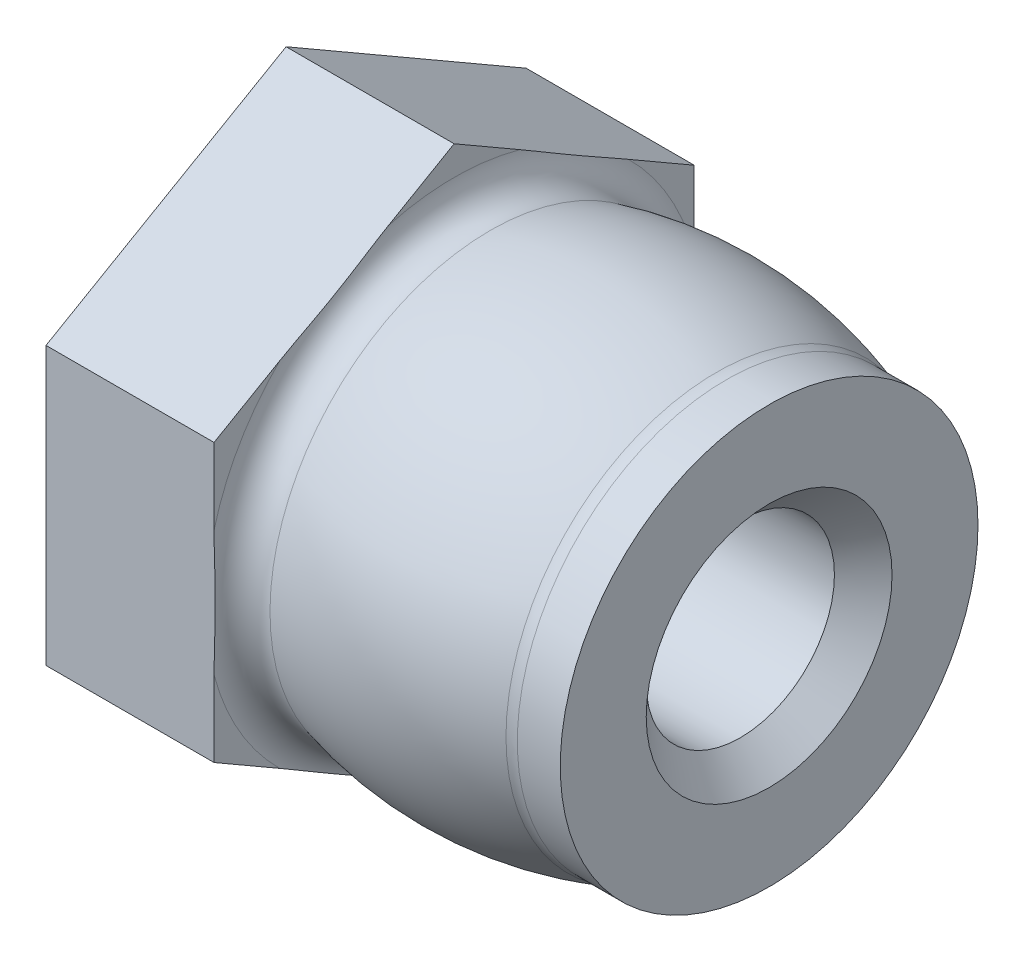
ISO-10303-21;
HEADER;
FILE_DESCRIPTION(('STEP AP214'),'2;1');
FILE_NAME('part.step','',(''),(''),'','','');
FILE_SCHEMA(('AUTOMOTIVE_DESIGN { 1 0 10303 214 1 1 1 1 }'));
ENDSEC;
DATA;
#1=APPLICATION_CONTEXT('core data for automotive mechanical design processes');
#2=APPLICATION_PROTOCOL_DEFINITION('international standard','automotive_design',2000,#1);
#3=PRODUCT_CONTEXT('',#1,'mechanical');
#4=PRODUCT('Part','Part','',(#3));
#5=PRODUCT_RELATED_PRODUCT_CATEGORY('part','',(#4));
#6=PRODUCT_DEFINITION_FORMATION('','',#4);
#7=PRODUCT_DEFINITION_CONTEXT('part definition',#1,'design');
#8=PRODUCT_DEFINITION('design','',#6,#7);
#9=PRODUCT_DEFINITION_SHAPE('','',#8);
#10=(LENGTH_UNIT() NAMED_UNIT(*) SI_UNIT(.MILLI.,.METRE.));
#11=(NAMED_UNIT(*) PLANE_ANGLE_UNIT() SI_UNIT($,.RADIAN.));
#12=(NAMED_UNIT(*) SI_UNIT($,.STERADIAN.) SOLID_ANGLE_UNIT());
#13=UNCERTAINTY_MEASURE_WITH_UNIT(LENGTH_MEASURE(1.E-05),#10,'distance_accuracy_value','');
#14=(GEOMETRIC_REPRESENTATION_CONTEXT(3) GLOBAL_UNCERTAINTY_ASSIGNED_CONTEXT((#13)) GLOBAL_UNIT_ASSIGNED_CONTEXT((#10,
#11,#12)) REPRESENTATION_CONTEXT('',''));
#15=CARTESIAN_POINT('',(0.,0.,0.));
#16=DIRECTION('',(0.,0.,1.));
#17=DIRECTION('',(1.,0.,0.));
#18=AXIS2_PLACEMENT_3D('',#15,#16,#17);
#19=CARTESIAN_POINT('',(-3.1496,0.,0.));
#20=DIRECTION('',(-1.,0.,0.));
#21=DIRECTION('',(0.,0.,1.));
#22=AXIS2_PLACEMENT_3D('',#19,#20,#21);
#23=TOROIDAL_SURFACE('',#22,3.28147087392028,0.381);
#24=CARTESIAN_POINT('',(-3.05302093023256,0.,0.));
#25=DIRECTION('',(1.,0.,0.));
#26=DIRECTION('',(0.,0.,-1.));
#27=AXIS2_PLACEMENT_3D('',#24,#25,#26);
#28=CIRCLE('',#27,2.91291493070018);
#29=CARTESIAN_POINT('',(-3.05302093023256,0.,-2.91291493070018));
#30=VERTEX_POINT('',#29);
#31=EDGE_CURVE('E208',#30,#30,#28,.T.);
#32=ORIENTED_EDGE('',*,*,#31,.F.);
#33=EDGE_LOOP('',(#32));
#34=FACE_BOUND('',#33,.T.);
#35=CARTESIAN_POINT('',(-3.5306,-2.33507484159772,-2.3055317348769));
#36=CARTESIAN_POINT('',(-3.53055765508547,-2.36684029242587,-2.25051236011721));
#37=CARTESIAN_POINT('',(-3.52958549215016,-2.39859672747296,-2.1955086011484));
#38=CARTESIAN_POINT('',(-3.52677003490047,-2.46210644959249,-2.08550653566278));
#39=CARTESIAN_POINT('',(-3.52492659318719,-2.49385973522266,-2.03050823164409));
#40=CARTESIAN_POINT('',(-3.52135849088085,-2.55735441103041,-1.92053222713495));
#41=CARTESIAN_POINT('',(-3.51963378238957,-2.58909580080618,-1.86555452734046));
#42=CARTESIAN_POINT('',(-3.51696013030434,-2.65258238657601,-1.75559253518804));
#43=CARTESIAN_POINT('',(-3.51601104894515,-2.68432758089205,-1.70060824573651));
#44=CARTESIAN_POINT('',(-3.51514199200617,-2.75609259313813,-1.5763075983205));
#45=CARTESIAN_POINT('',(-3.51555451918949,-2.79611362793693,-1.50698913267749));
#46=CARTESIAN_POINT('',(-3.5179633927956,-2.8761502624632,-1.36836161521118));
#47=CARTESIAN_POINT('',(-3.5199600992427,-2.91616585888692,-1.29905256911013));
#48=CARTESIAN_POINT('',(-3.52437818788094,-2.99621263915529,-1.16040747870301));
#49=CARTESIAN_POINT('',(-3.52679980587722,-3.03624381927555,-1.09107144084778));
#50=CARTESIAN_POINT('',(-3.5293489035481,-3.09629907157537,-0.987052692603111));
#51=CARTESIAN_POINT('',(-3.5300180297608,-3.11631606273206,-0.952382246905067));
#52=CARTESIAN_POINT('',(-3.53069426141412,-3.15635563444809,-0.883031674379615));
#53=CARTESIAN_POINT('',(-3.53070126070804,-3.17637821538903,-0.848351546891233));
#54=CARTESIAN_POINT('',(-3.53022641879167,-3.19640081785184,-0.813671382125909));
#55=B_SPLINE_CURVE_WITH_KNOTS('',3,(#35,#36,#37,#38,#39,#40,#41,#42,#43,#44,#45,#46,#47,#48,#49,
#50,#51,#52,#53,#54),.UNSPECIFIED.,.F.,.F.,(4,2,2,2,2,2,2,2,2,4),(0.,0.190563513789127,
0.381159277771389,0.571677697342065,0.762162270079211,1.00227005055033,1.24243241411767,
1.48272848003566,1.6028424420732,1.72297565975444),.UNSPECIFIED.);
#56=CARTESIAN_POINT('',(-3.5306,-2.33507484159772,-2.3055317348769));
#57=VERTEX_POINT('',#56);
#58=CARTESIAN_POINT('',(-3.5306,-3.16418647243347,-0.869468265123098));
#59=VERTEX_POINT('',#58);
#60=EDGE_CURVE('E290',#57,#59,#55,.T.);
#61=ORIENTED_EDGE('',*,*,#60,.F.);
#62=CARTESIAN_POINT('',(-3.5306,0.,0.));
#63=DIRECTION('',(-1.,0.,0.));
#64=DIRECTION('',(0.,0.,1.));
#65=AXIS2_PLACEMENT_3D('',#62,#63,#64);
#66=CIRCLE('',#65,3.28147087392028);
#67=CARTESIAN_POINT('',(-3.5306,-0.829111630835748,-3.175));
#68=VERTEX_POINT('',#67);
#69=EDGE_CURVE('E193',#68,#57,#66,.T.);
#70=ORIENTED_EDGE('',*,*,#69,.F.);
#71=CARTESIAN_POINT('',(-3.5306,0.829111630835748,-3.175));
#72=CARTESIAN_POINT('',(-3.53055765508547,0.765580729179442,-3.175));
#73=CARTESIAN_POINT('',(-3.52958549215016,0.702067859085271,-3.175));
#74=CARTESIAN_POINT('',(-3.52677003490047,0.575048414846204,-3.175));
#75=CARTESIAN_POINT('',(-3.52492659318719,0.511541843585867,-3.175));
#76=CARTESIAN_POINT('',(-3.52135849088085,0.384552491970374,-3.175));
#77=CARTESIAN_POINT('',(-3.51963378238957,0.32106971241882,-3.175));
#78=CARTESIAN_POINT('',(-3.51696013030434,0.19409654087916,-3.175));
#79=CARTESIAN_POINT('',(-3.51601104894515,0.130606152247084,-3.175));
#80=CARTESIAN_POINT('',(-3.51514199200617,-0.0129238722450689,-3.175));
#81=CARTESIAN_POINT('',(-3.51555451918949,-0.0929659418426836,-3.175));
#82=CARTESIAN_POINT('',(-3.5179633927956,-0.253039210895213,-3.175));
#83=CARTESIAN_POINT('',(-3.5199600992427,-0.333070403742649,-3.175));
#84=CARTESIAN_POINT('',(-3.52437818788094,-0.493163964279386,-3.175));
#85=CARTESIAN_POINT('',(-3.52679980587722,-0.573226324519909,-3.175));
#86=CARTESIAN_POINT('',(-3.5293489035481,-0.69333682911956,-3.175));
#87=CARTESIAN_POINT('',(-3.5300180297608,-0.733370811432939,-3.175));
#88=CARTESIAN_POINT('',(-3.53069426141412,-0.813449954864989,-3.175));
#89=CARTESIAN_POINT('',(-3.53070126070804,-0.853495116746885,-3.175));
#90=CARTESIAN_POINT('',(-3.53022641879167,-0.893540321672486,-3.175));
#91=B_SPLINE_CURVE_WITH_KNOTS('',3,(#71,#72,#73,#74,#75,#76,#77,#78,#79,#80,#81,#82,#83,#84,#85,
#86,#87,#88,#89,#90),.UNSPECIFIED.,.F.,.F.,(4,2,2,2,2,2,2,2,2,4),(0.,0.190563513789126,
0.381159277771389,0.571677697342065,0.76216227007921,1.00227005055033,1.24243241411767,
1.48272848003566,1.6028424420732,1.72297565975444),.UNSPECIFIED.);
#92=CARTESIAN_POINT('',(-3.5306,0.829111630835748,-3.175));
#93=VERTEX_POINT('',#92);
#94=EDGE_CURVE('E63',#93,#68,#91,.T.);
#95=ORIENTED_EDGE('',*,*,#94,.F.);
#96=CARTESIAN_POINT('',(-3.5306,0.,0.));
#97=DIRECTION('',(-1.,0.,0.));
#98=DIRECTION('',(0.,0.,1.));
#99=AXIS2_PLACEMENT_3D('',#96,#97,#98);
#100=CIRCLE('',#99,3.28147087392028);
#101=CARTESIAN_POINT('',(-3.5306,2.33507484159772,-2.3055317348769));
#102=VERTEX_POINT('',#101);
#103=EDGE_CURVE('E196',#102,#93,#100,.T.);
#104=ORIENTED_EDGE('',*,*,#103,.F.);
#105=CARTESIAN_POINT('',(-3.5306,3.16418647243347,-0.869468265123102));
#106=CARTESIAN_POINT('',(-3.53055765508547,3.13242102160531,-0.924487639882794));
#107=CARTESIAN_POINT('',(-3.52958549215016,3.10066458655823,-0.979491398851606));
#108=CARTESIAN_POINT('',(-3.52677003490047,3.03715486443869,-1.08949346433722));
#109=CARTESIAN_POINT('',(-3.52492659318719,3.00540157880852,-1.14449176835592));
#110=CARTESIAN_POINT('',(-3.52135849088085,2.94190690300078,-1.25446777286505));
#111=CARTESIAN_POINT('',(-3.51963378238957,2.910165513225,-1.30944547265954));
#112=CARTESIAN_POINT('',(-3.51696013030434,2.84667892745517,-1.41940746481197));
#113=CARTESIAN_POINT('',(-3.51601104894515,2.81493373313913,-1.47439175426349));
#114=CARTESIAN_POINT('',(-3.51514199200617,2.74316872089306,-1.5986924016795));
#115=CARTESIAN_POINT('',(-3.51555451918949,2.70314768609425,-1.66801086732251));
#116=CARTESIAN_POINT('',(-3.5179633927956,2.62311105156799,-1.80663838478882));
#117=CARTESIAN_POINT('',(-3.5199600992427,2.58309545514427,-1.87594743088987));
#118=CARTESIAN_POINT('',(-3.52437818788094,2.50304867487591,-2.01459252129698));
#119=CARTESIAN_POINT('',(-3.52679980587722,2.46301749475565,-2.08392855915221));
#120=CARTESIAN_POINT('',(-3.5293489035481,2.40296224245582,-2.18794730739688));
#121=CARTESIAN_POINT('',(-3.5300180297608,2.38294525129913,-2.22261775309492));
#122=CARTESIAN_POINT('',(-3.53069426141412,2.34290567958311,-2.29196832562037));
#123=CARTESIAN_POINT('',(-3.53070126070804,2.32288309864216,-2.32664845310875));
#124=CARTESIAN_POINT('',(-3.53022641879167,2.30286049617936,-2.36132861787408));
#125=B_SPLINE_CURVE_WITH_KNOTS('',3,(#105,#106,#107,#108,#109,#110,#111,#112,#113,#114,#115,
#116,#117,#118,#119,#120,#121,#122,#123,#124),.UNSPECIFIED.,.F.,.F.,(4,2,2,2,2,2,2,2,2,4),(0.,
0.190563513789126,0.381159277771389,0.571677697342065,0.76216227007921,1.00227005055032,
1.24243241411765,1.48272848003564,1.60284244207318,1.72297565975442),.UNSPECIFIED.);
#126=CARTESIAN_POINT('',(-3.5306,3.16418647243347,-0.869468265123102));
#127=VERTEX_POINT('',#126);
#128=EDGE_CURVE('E251',#127,#102,#125,.T.);
#129=ORIENTED_EDGE('',*,*,#128,.F.);
#130=CARTESIAN_POINT('',(-3.5306,0.,0.));
#131=DIRECTION('',(-1.,0.,0.));
#132=DIRECTION('',(0.,0.,1.));
#133=AXIS2_PLACEMENT_3D('',#130,#131,#132);
#134=CIRCLE('',#133,3.28147087392028);
#135=CARTESIAN_POINT('',(-3.5306,3.16418647243347,0.869468265123102));
#136=VERTEX_POINT('',#135);
#137=EDGE_CURVE('E143',#136,#127,#134,.T.);
#138=ORIENTED_EDGE('',*,*,#137,.F.);
#139=CARTESIAN_POINT('',(-3.5306,2.33507484159772,2.3055317348769));
#140=CARTESIAN_POINT('',(-3.53055765508547,2.36684029242588,2.25051236011721));
#141=CARTESIAN_POINT('',(-3.52958549215016,2.39859672747296,2.19550860114839));
#142=CARTESIAN_POINT('',(-3.52677003490047,2.4621064495925,2.08550653566278));
#143=CARTESIAN_POINT('',(-3.52492659318719,2.49385973522266,2.03050823164408));
#144=CARTESIAN_POINT('',(-3.52135849088085,2.55735441103041,1.92053222713495));
#145=CARTESIAN_POINT('',(-3.51963378238957,2.58909580080619,1.86555452734046));
#146=CARTESIAN_POINT('',(-3.51696013030434,2.65258238657602,1.75559253518803));
#147=CARTESIAN_POINT('',(-3.51601104894515,2.68432758089205,1.70060824573651));
#148=CARTESIAN_POINT('',(-3.51514199200617,2.75609259313813,1.5763075983205));
#149=CARTESIAN_POINT('',(-3.51555451918949,2.79611362793694,1.50698913267749));
#150=CARTESIAN_POINT('',(-3.5179633927956,2.8761502624632,1.36836161521118));
#151=CARTESIAN_POINT('',(-3.5199600992427,2.91616585888692,1.29905256911013));
#152=CARTESIAN_POINT('',(-3.52437818788094,2.99621263915528,1.16040747870302));
#153=CARTESIAN_POINT('',(-3.52679980587722,3.03624381927554,1.09107144084778));
#154=CARTESIAN_POINT('',(-3.5293489035481,3.09629907157537,0.987052692603121));
#155=CARTESIAN_POINT('',(-3.5300180297608,3.11631606273206,0.952382246905078));
#156=CARTESIAN_POINT('',(-3.53069426141412,3.15635563444808,0.883031674379627));
#157=CARTESIAN_POINT('',(-3.53070126070804,3.17637821538903,0.848351546891246));
#158=CARTESIAN_POINT('',(-3.53022641879167,3.19640081785183,0.813671382125922));
#159=B_SPLINE_CURVE_WITH_KNOTS('',3,(#139,#140,#141,#142,#143,#144,#145,#146,#147,#148,#149,
#150,#151,#152,#153,#154,#155,#156,#157,#158),.UNSPECIFIED.,.F.,.F.,(4,2,2,2,2,2,2,2,2,4),(0.,
0.190563513789126,0.381159277771389,0.571677697342065,0.76216227007921,1.00227005055032,
1.24243241411765,1.48272848003564,1.60284244207318,1.72297565975442),.UNSPECIFIED.);
#160=CARTESIAN_POINT('',(-3.5306,2.33507484159772,2.3055317348769));
#161=VERTEX_POINT('',#160);
#162=EDGE_CURVE('E156',#161,#136,#159,.T.);
#163=ORIENTED_EDGE('',*,*,#162,.F.);
#164=CARTESIAN_POINT('',(-3.5306,0.,0.));
#165=DIRECTION('',(-1.,0.,0.));
#166=DIRECTION('',(0.,0.,1.));
#167=AXIS2_PLACEMENT_3D('',#164,#165,#166);
#168=CIRCLE('',#167,3.28147087392028);
#169=CARTESIAN_POINT('',(-3.5306,0.82911163083575,3.175));
#170=VERTEX_POINT('',#169);
#171=EDGE_CURVE('E199',#170,#161,#168,.T.);
#172=ORIENTED_EDGE('',*,*,#171,.F.);
#173=CARTESIAN_POINT('',(-3.5306,-0.82911163083575,3.175));
#174=CARTESIAN_POINT('',(-3.53055765508547,-0.765580729179444,3.175));
#175=CARTESIAN_POINT('',(-3.52958549215016,-0.702067859085273,3.175));
#176=CARTESIAN_POINT('',(-3.52677003490047,-0.575048414846206,3.175));
#177=CARTESIAN_POINT('',(-3.52492659318719,-0.511541843585869,3.175));
#178=CARTESIAN_POINT('',(-3.52135849088085,-0.384552491970376,3.175));
#179=CARTESIAN_POINT('',(-3.51963378238957,-0.321069712418823,3.175));
#180=CARTESIAN_POINT('',(-3.51696013030434,-0.194096540879162,3.175));
#181=CARTESIAN_POINT('',(-3.51601104894515,-0.130606152247087,3.175));
#182=CARTESIAN_POINT('',(-3.51514199200617,0.0129238722450674,3.175));
#183=CARTESIAN_POINT('',(-3.51555451918949,0.0929659418426831,3.175));
#184=CARTESIAN_POINT('',(-3.5179633927956,0.253039210895214,3.175));
#185=CARTESIAN_POINT('',(-3.5199600992427,0.333070403742651,3.175));
#186=CARTESIAN_POINT('',(-3.52437818788094,0.493163964279391,3.175));
#187=CARTESIAN_POINT('',(-3.52679980587722,0.573226324519914,3.175));
#188=CARTESIAN_POINT('',(-3.5293489035481,0.693336829119567,3.175));
#189=CARTESIAN_POINT('',(-3.5300180297608,0.733370811432947,3.175));
#190=CARTESIAN_POINT('',(-3.53069426141412,0.813449954864998,3.175));
#191=CARTESIAN_POINT('',(-3.53070126070804,0.853495116746894,3.175));
#192=CARTESIAN_POINT('',(-3.53022641879167,0.893540321672496,3.175));
#193=B_SPLINE_CURVE_WITH_KNOTS('',3,(#173,#174,#175,#176,#177,#178,#179,#180,#181,#182,#183,
#184,#185,#186,#187,#188,#189,#190,#191,#192),.UNSPECIFIED.,.F.,.F.,(4,2,2,2,2,2,2,2,2,4),(0.,
0.190563513789126,0.381159277771389,0.571677697342065,0.76216227007921,1.00227005055033,
1.24243241411767,1.48272848003567,1.60284244207321,1.72297565975445),.UNSPECIFIED.);
#194=CARTESIAN_POINT('',(-3.5306,-0.82911163083575,3.175));
#195=VERTEX_POINT('',#194);
#196=EDGE_CURVE('E219',#195,#170,#193,.T.);
#197=ORIENTED_EDGE('',*,*,#196,.F.);
#198=CARTESIAN_POINT('',(-3.5306,0.,0.));
#199=DIRECTION('',(-1.,0.,0.));
#200=DIRECTION('',(0.,0.,1.));
#201=AXIS2_PLACEMENT_3D('',#198,#199,#200);
#202=CIRCLE('',#201,3.28147087392028);
#203=CARTESIAN_POINT('',(-3.5306,-2.33507484159772,2.3055317348769));
#204=VERTEX_POINT('',#203);
#205=EDGE_CURVE('E202',#204,#195,#202,.T.);
#206=ORIENTED_EDGE('',*,*,#205,.F.);
#207=CARTESIAN_POINT('',(-3.5306,-3.16418647243347,0.869468265123098));
#208=CARTESIAN_POINT('',(-3.53055765508547,-3.13242102160531,0.92448763988279));
#209=CARTESIAN_POINT('',(-3.52958549215016,-3.10066458655823,0.979491398851602));
#210=CARTESIAN_POINT('',(-3.52677003490047,-3.03715486443869,1.08949346433722));
#211=CARTESIAN_POINT('',(-3.52492659318719,-3.00540157880853,1.14449176835591));
#212=CARTESIAN_POINT('',(-3.52135849088085,-2.94190690300078,1.25446777286505));
#213=CARTESIAN_POINT('',(-3.51963378238957,-2.910165513225,1.30944547265954));
#214=CARTESIAN_POINT('',(-3.51696013030434,-2.84667892745517,1.41940746481196));
#215=CARTESIAN_POINT('',(-3.51601104894515,-2.81493373313913,1.47439175426349));
#216=CARTESIAN_POINT('',(-3.51514199200617,-2.74316872089306,1.59869240167949));
#217=CARTESIAN_POINT('',(-3.51555451918949,-2.70314768609425,1.66801086732251));
#218=CARTESIAN_POINT('',(-3.5179633927956,-2.62311105156799,1.80663838478882));
#219=CARTESIAN_POINT('',(-3.5199600992427,-2.58309545514427,1.87594743088987));
#220=CARTESIAN_POINT('',(-3.52437818788094,-2.5030486748759,2.01459252129699));
#221=CARTESIAN_POINT('',(-3.52679980587722,-2.46301749475564,2.08392855915222));
#222=CARTESIAN_POINT('',(-3.5293489035481,-2.40296224245581,2.18794730739689));
#223=CARTESIAN_POINT('',(-3.5300180297608,-2.38294525129912,2.22261775309493));
#224=CARTESIAN_POINT('',(-3.53069426141412,-2.3429056795831,2.29196832562038));
#225=CARTESIAN_POINT('',(-3.53070126070804,-2.32288309864215,2.32664845310876));
#226=CARTESIAN_POINT('',(-3.53022641879167,-2.30286049617935,2.36132861787409));
#227=B_SPLINE_CURVE_WITH_KNOTS('',3,(#207,#208,#209,#210,#211,#212,#213,#214,#215,#216,#217,
#218,#219,#220,#221,#222,#223,#224,#225,#226),.UNSPECIFIED.,.F.,.F.,(4,2,2,2,2,2,2,2,2,4),(0.,
0.190563513789126,0.381159277771389,0.571677697342066,0.762162270079211,1.00227005055033,
1.24243241411766,1.48272848003566,1.60284244207319,1.72297565975444),.UNSPECIFIED.);
#228=CARTESIAN_POINT('',(-3.5306,-3.16418647243347,0.869468265123098));
#229=VERTEX_POINT('',#228);
#230=EDGE_CURVE('E211',#229,#204,#227,.T.);
#231=ORIENTED_EDGE('',*,*,#230,.F.);
#232=CARTESIAN_POINT('',(-3.5306,0.,0.));
#233=DIRECTION('',(-1.,0.,0.));
#234=DIRECTION('',(0.,0.,1.));
#235=AXIS2_PLACEMENT_3D('',#232,#233,#234);
#236=CIRCLE('',#235,3.28147087392028);
#237=EDGE_CURVE('E205',#59,#229,#236,.T.);
#238=ORIENTED_EDGE('',*,*,#237,.F.);
#239=EDGE_LOOP('',(#61,#70,#95,#104,#129,#138,#163,#172,#197,#206,#231,#238));
#240=FACE_BOUND('',#239,.T.);
#241=ADVANCED_FACE('F47',(#34,#240),#23,.F.);
#242=CARTESIAN_POINT('',(-3.5306,3.175,0.));
#243=DIRECTION('',(-1.,0.,0.));
#244=DIRECTION('',(0.,0.,1.));
#245=AXIS2_PLACEMENT_3D('',#242,#243,#244);
#246=PLANE('',#245);
#247=DIRECTION('',(0.,0.5,-0.866025403784439));
#248=VECTOR('',#247,1.);
#249=CARTESIAN_POINT('',(-3.53060000000001,-2.74963065701559,-1.5875));
#250=LINE('',#249,#248);
#251=CARTESIAN_POINT('',(-3.53060000000001,-3.66617420935412,0.));
#252=VERTEX_POINT('',#251);
#253=EDGE_CURVE('E183',#252,#59,#250,.T.);
#254=ORIENTED_EDGE('',*,*,#253,.T.);
#255=ORIENTED_EDGE('',*,*,#237,.T.);
#256=DIRECTION('',(0.,-0.5,-0.866025403784439));
#257=VECTOR('',#256,1.);
#258=CARTESIAN_POINT('',(-3.53060000000001,-2.74963065701559,1.5875));
#259=LINE('',#258,#257);
#260=EDGE_CURVE('E178',#229,#252,#259,.T.);
#261=ORIENTED_EDGE('',*,*,#260,.T.);
#262=EDGE_LOOP('',(#254,#255,#261));
#263=FACE_BOUND('',#262,.T.);
#264=ADVANCED_FACE('F278',(#263),#246,.F.);
#265=CARTESIAN_POINT('',(-3.53060000000001,-1.83308710467706,3.175));
#266=VERTEX_POINT('',#265);
#267=EDGE_CURVE('E179',#266,#204,#259,.T.);
#268=ORIENTED_EDGE('',*,*,#267,.T.);
#269=ORIENTED_EDGE('',*,*,#205,.T.);
#270=DIRECTION('',(0.,-1.,0.));
#271=VECTOR('',#270,1.);
#272=CARTESIAN_POINT('',(-3.53060000000001,0.,3.175));
#273=LINE('',#272,#271);
#274=EDGE_CURVE('E157',#195,#266,#273,.T.);
#275=ORIENTED_EDGE('',*,*,#274,.T.);
#276=EDGE_LOOP('',(#268,#269,#275));
#277=FACE_BOUND('',#276,.T.);
#278=ADVANCED_FACE('F284',(#277),#246,.F.);
#279=CARTESIAN_POINT('',(-3.53060000000001,1.83308710467706,3.175));
#280=VERTEX_POINT('',#279);
#281=EDGE_CURVE('E175',#280,#170,#273,.T.);
#282=ORIENTED_EDGE('',*,*,#281,.T.);
#283=ORIENTED_EDGE('',*,*,#171,.T.);
#284=DIRECTION('',(0.,-0.5,0.866025403784439));
#285=VECTOR('',#284,1.);
#286=CARTESIAN_POINT('',(-3.53060000000001,2.74963065701559,1.5875));
#287=LINE('',#286,#285);
#288=EDGE_CURVE('E158',#161,#280,#287,.T.);
#289=ORIENTED_EDGE('',*,*,#288,.T.);
#290=EDGE_LOOP('',(#282,#283,#289));
#291=FACE_BOUND('',#290,.T.);
#292=ADVANCED_FACE('F319',(#291),#246,.F.);
#293=CARTESIAN_POINT('',(-3.53060000000001,3.66617420935412,0.));
#294=VERTEX_POINT('',#293);
#295=EDGE_CURVE('E141',#294,#136,#287,.T.);
#296=ORIENTED_EDGE('',*,*,#295,.T.);
#297=ORIENTED_EDGE('',*,*,#137,.T.);
#298=DIRECTION('',(0.,0.5,0.866025403784439));
#299=VECTOR('',#298,1.);
#300=CARTESIAN_POINT('',(-3.53060000000001,2.74963065701559,-1.5875));
#301=LINE('',#300,#299);
#302=EDGE_CURVE('E138',#127,#294,#301,.T.);
#303=ORIENTED_EDGE('',*,*,#302,.T.);
#304=EDGE_LOOP('',(#296,#297,#303));
#305=FACE_BOUND('',#304,.T.);
#306=ADVANCED_FACE('F140',(#305),#246,.F.);
#307=CARTESIAN_POINT('',(-3.53060000000001,1.83308710467706,-3.175));
#308=VERTEX_POINT('',#307);
#309=EDGE_CURVE('E146',#308,#102,#301,.T.);
#310=ORIENTED_EDGE('',*,*,#309,.T.);
#311=ORIENTED_EDGE('',*,*,#103,.T.);
#312=DIRECTION('',(0.,1.,0.));
#313=VECTOR('',#312,1.);
#314=CARTESIAN_POINT('',(-3.53060000000001,0.,-3.175));
#315=LINE('',#314,#313);
#316=EDGE_CURVE('E186',#93,#308,#315,.T.);
#317=ORIENTED_EDGE('',*,*,#316,.T.);
#318=EDGE_LOOP('',(#310,#311,#317));
#319=FACE_BOUND('',#318,.T.);
#320=ADVANCED_FACE('F327',(#319),#246,.F.);
#321=CARTESIAN_POINT('',(-1.7653,0.,0.));
#322=DIRECTION('',(-1.,0.,0.));
#323=DIRECTION('',(0.,0.,1.));
#324=AXIS2_PLACEMENT_3D('',#321,#322,#323);
#325=DEGENERATE_TOROIDAL_SURFACE('',#324,2.00116431223445,5.08,.F.);
#326=CARTESIAN_POINT('',(-0.060784345859428,0.,0.));
#327=DIRECTION('',(-1.,0.,0.));
#328=DIRECTION('',(0.,0.,1.));
#329=AXIS2_PLACEMENT_3D('',#326,#327,#328);
#330=CIRCLE('',#329,2.78433737356504);
#331=CARTESIAN_POINT('',(-0.060784345859428,0.,2.78433737356504));
#332=VERTEX_POINT('',#331);
#333=EDGE_CURVE('E350',#332,#332,#330,.T.);
#334=ORIENTED_EDGE('',*,*,#333,.T.);
#335=EDGE_LOOP('',(#334));
#336=FACE_BOUND('',#335,.T.);
#337=ORIENTED_EDGE('',*,*,#31,.T.);
#338=EDGE_LOOP('',(#337));
#339=FACE_BOUND('',#338,.T.);
#340=ADVANCED_FACE('F340',(#336,#339),#325,.F.);
#341=CARTESIAN_POINT('',(-3.53060000000001,-1.83308710467706,-3.175));
#342=VERTEX_POINT('',#341);
#343=EDGE_CURVE('E147',#342,#68,#315,.T.);
#344=ORIENTED_EDGE('',*,*,#343,.T.);
#345=ORIENTED_EDGE('',*,*,#69,.T.);
#346=EDGE_CURVE('E182',#57,#342,#250,.T.);
#347=ORIENTED_EDGE('',*,*,#346,.T.);
#348=EDGE_LOOP('',(#344,#345,#347));
#349=FACE_BOUND('',#348,.T.);
#350=ADVANCED_FACE('F287',(#349),#246,.F.);
#351=CARTESIAN_POINT('',(-5.7531,1.2446,0.));
#352=DIRECTION('',(1.,0.,0.));
#353=DIRECTION('',(0.,0.,-1.));
#354=AXIS2_PLACEMENT_3D('',#351,#352,#353);
#355=PLANE('',#354);
#356=CARTESIAN_POINT('',(-5.7531,0.,0.));
#357=DIRECTION('',(-1.,0.,0.));
#358=DIRECTION('',(0.,0.,1.));
#359=AXIS2_PLACEMENT_3D('',#356,#357,#358);
#360=CIRCLE('',#359,1.2446);
#361=CARTESIAN_POINT('',(-5.7531,0.,1.2446));
#362=VERTEX_POINT('',#361);
#363=EDGE_CURVE('E190',#362,#362,#360,.T.);
#364=ORIENTED_EDGE('',*,*,#363,.F.);
#365=EDGE_LOOP('',(#364));
#366=FACE_BOUND('',#365,.T.);
#367=DIRECTION('',(0.,0.5,0.866025403784439));
#368=VECTOR('',#367,1.);
#369=CARTESIAN_POINT('',(-5.7531,-2.74963065701559,1.5875));
#370=LINE('',#369,#368);
#371=CARTESIAN_POINT('',(-5.7531,-3.66617420935412,0.));
#372=VERTEX_POINT('',#371);
#373=CARTESIAN_POINT('',(-5.7531,-1.83308710467706,3.175));
#374=VERTEX_POINT('',#373);
#375=EDGE_CURVE('E312',#372,#374,#370,.T.);
#376=ORIENTED_EDGE('',*,*,#375,.T.);
#377=DIRECTION('',(0.,1.,0.));
#378=VECTOR('',#377,1.);
#379=CARTESIAN_POINT('',(-5.7531,0.,3.175));
#380=LINE('',#379,#378);
#381=CARTESIAN_POINT('',(-5.7531,1.83308710467706,3.175));
#382=VERTEX_POINT('',#381);
#383=EDGE_CURVE('E314',#374,#382,#380,.T.);
#384=ORIENTED_EDGE('',*,*,#383,.T.);
#385=DIRECTION('',(0.,0.5,-0.866025403784439));
#386=VECTOR('',#385,1.);
#387=CARTESIAN_POINT('',(-5.7531,2.74963065701559,1.5875));
#388=LINE('',#387,#386);
#389=CARTESIAN_POINT('',(-5.7531,3.66617420935412,0.));
#390=VERTEX_POINT('',#389);
#391=EDGE_CURVE('E302',#382,#390,#388,.T.);
#392=ORIENTED_EDGE('',*,*,#391,.T.);
#393=DIRECTION('',(0.,-0.5,-0.866025403784439));
#394=VECTOR('',#393,1.);
#395=CARTESIAN_POINT('',(-5.7531,2.74963065701559,-1.5875));
#396=LINE('',#395,#394);
#397=CARTESIAN_POINT('',(-5.7531,1.83308710467706,-3.175));
#398=VERTEX_POINT('',#397);
#399=EDGE_CURVE('E162',#390,#398,#396,.T.);
#400=ORIENTED_EDGE('',*,*,#399,.T.);
#401=DIRECTION('',(0.,-1.,0.));
#402=VECTOR('',#401,1.);
#403=CARTESIAN_POINT('',(-5.7531,0.,-3.175));
#404=LINE('',#403,#402);
#405=CARTESIAN_POINT('',(-5.7531,-1.83308710467706,-3.175));
#406=VERTEX_POINT('',#405);
#407=EDGE_CURVE('E309',#398,#406,#404,.T.);
#408=ORIENTED_EDGE('',*,*,#407,.T.);
#409=DIRECTION('',(0.,-0.5,0.866025403784439));
#410=VECTOR('',#409,1.);
#411=CARTESIAN_POINT('',(-5.7531,-2.74963065701559,-1.5875));
#412=LINE('',#411,#410);
#413=EDGE_CURVE('E299',#406,#372,#412,.T.);
#414=ORIENTED_EDGE('',*,*,#413,.T.);
#415=EDGE_LOOP('',(#376,#384,#392,#400,#408,#414));
#416=FACE_BOUND('',#415,.T.);
#417=ADVANCED_FACE('F323',(#366,#416),#355,.F.);
#418=CARTESIAN_POINT('',(-60.338913038737,0.,0.));
#419=DIRECTION('',(-1.,0.,0.));
#420=DIRECTION('',(0.,0.,1.));
#421=AXIS2_PLACEMENT_3D('',#418,#419,#420);
#422=CYLINDRICAL_SURFACE('',#421,1.2446);
#423=CARTESIAN_POINT('',(0.253999999999997,0.,0.));
#424=DIRECTION('',(1.,0.,0.));
#425=DIRECTION('',(0.,0.,-1.));
#426=AXIS2_PLACEMENT_3D('',#423,#424,#425);
#427=CIRCLE('',#426,1.2446);
#428=CARTESIAN_POINT('',(0.253999999999997,0.,-1.2446));
#429=VERTEX_POINT('',#428);
#430=EDGE_CURVE('E56',#429,#429,#427,.T.);
#431=ORIENTED_EDGE('',*,*,#430,.T.);
#432=EDGE_LOOP('',(#431));
#433=FACE_BOUND('',#432,.T.);
#434=ORIENTED_EDGE('',*,*,#363,.T.);
#435=EDGE_LOOP('',(#434));
#436=FACE_BOUND('',#435,.T.);
#437=ADVANCED_FACE('F244',(#433,#436),#422,.F.);
#438=CARTESIAN_POINT('',(6.16918522098986,2.74963065701559,1.5875));
#439=DIRECTION('',(0.,0.866025403784439,0.5));
#440=DIRECTION('',(0.,-0.5,0.866025403784439));
#441=AXIS2_PLACEMENT_3D('',#438,#439,#440);
#442=PLANE('',#441);
#443=DIRECTION('',(-1.,0.,0.));
#444=VECTOR('',#443,1.);
#445=CARTESIAN_POINT('',(6.16918522098986,3.66617420935412,0.));
#446=LINE('',#445,#444);
#447=EDGE_CURVE('E153',#294,#390,#446,.T.);
#448=ORIENTED_EDGE('',*,*,#447,.T.);
#449=ORIENTED_EDGE('',*,*,#391,.F.);
#450=DIRECTION('',(-1.,0.,0.));
#451=VECTOR('',#450,1.);
#452=CARTESIAN_POINT('',(6.16918522098986,1.83308710467706,3.175));
#453=LINE('',#452,#451);
#454=EDGE_CURVE('E163',#280,#382,#453,.T.);
#455=ORIENTED_EDGE('',*,*,#454,.F.);
#456=ORIENTED_EDGE('',*,*,#288,.F.);
#457=ORIENTED_EDGE('',*,*,#162,.T.);
#458=ORIENTED_EDGE('',*,*,#295,.F.);
#459=EDGE_LOOP('',(#448,#449,#455,#456,#457,#458));
#460=FACE_BOUND('',#459,.T.);
#461=ADVANCED_FACE('F151',(#460),#442,.T.);
#462=CARTESIAN_POINT('',(6.16918522098986,0.,3.175));
#463=DIRECTION('',(0.,0.,1.));
#464=DIRECTION('',(0.,-1.,0.));
#465=AXIS2_PLACEMENT_3D('',#462,#463,#464);
#466=PLANE('',#465);
#467=ORIENTED_EDGE('',*,*,#383,.F.);
#468=DIRECTION('',(-1.,0.,0.));
#469=VECTOR('',#468,1.);
#470=CARTESIAN_POINT('',(6.16918522098986,-1.83308710467706,3.175));
#471=LINE('',#470,#469);
#472=EDGE_CURVE('E167',#266,#374,#471,.T.);
#473=ORIENTED_EDGE('',*,*,#472,.F.);
#474=ORIENTED_EDGE('',*,*,#274,.F.);
#475=ORIENTED_EDGE('',*,*,#196,.T.);
#476=ORIENTED_EDGE('',*,*,#281,.F.);
#477=ORIENTED_EDGE('',*,*,#454,.T.);
#478=EDGE_LOOP('',(#467,#473,#474,#475,#476,#477));
#479=FACE_BOUND('',#478,.T.);
#480=ADVANCED_FACE('F233',(#479),#466,.T.);
#481=CARTESIAN_POINT('',(6.16918522098986,-2.74963065701559,1.5875));
#482=DIRECTION('',(0.,-0.866025403784439,0.5));
#483=DIRECTION('',(0.,-0.5,-0.866025403784439));
#484=AXIS2_PLACEMENT_3D('',#481,#482,#483);
#485=PLANE('',#484);
#486=ORIENTED_EDGE('',*,*,#472,.T.);
#487=ORIENTED_EDGE('',*,*,#375,.F.);
#488=DIRECTION('',(-1.,0.,0.));
#489=VECTOR('',#488,1.);
#490=CARTESIAN_POINT('',(6.16918522098986,-3.66617420935412,0.));
#491=LINE('',#490,#489);
#492=EDGE_CURVE('E301',#252,#372,#491,.T.);
#493=ORIENTED_EDGE('',*,*,#492,.F.);
#494=ORIENTED_EDGE('',*,*,#260,.F.);
#495=ORIENTED_EDGE('',*,*,#230,.T.);
#496=ORIENTED_EDGE('',*,*,#267,.F.);
#497=EDGE_LOOP('',(#486,#487,#493,#494,#495,#496));
#498=FACE_BOUND('',#497,.T.);
#499=ADVANCED_FACE('F228',(#498),#485,.T.);
#500=CARTESIAN_POINT('',(6.16918522098986,-2.74963065701559,-1.5875));
#501=DIRECTION('',(0.,-0.866025403784439,-0.5));
#502=DIRECTION('',(0.,0.5,-0.866025403784439));
#503=AXIS2_PLACEMENT_3D('',#500,#501,#502);
#504=PLANE('',#503);
#505=ORIENTED_EDGE('',*,*,#492,.T.);
#506=ORIENTED_EDGE('',*,*,#413,.F.);
#507=DIRECTION('',(-1.,0.,0.));
#508=VECTOR('',#507,1.);
#509=CARTESIAN_POINT('',(6.16918522098986,-1.83308710467706,-3.175));
#510=LINE('',#509,#508);
#511=EDGE_CURVE('E298',#342,#406,#510,.T.);
#512=ORIENTED_EDGE('',*,*,#511,.F.);
#513=ORIENTED_EDGE('',*,*,#346,.F.);
#514=ORIENTED_EDGE('',*,*,#60,.T.);
#515=ORIENTED_EDGE('',*,*,#253,.F.);
#516=EDGE_LOOP('',(#505,#506,#512,#513,#514,#515));
#517=FACE_BOUND('',#516,.T.);
#518=ADVANCED_FACE('F232',(#517),#504,.T.);
#519=CARTESIAN_POINT('',(6.16918522098986,0.,-3.175));
#520=DIRECTION('',(0.,0.,-1.));
#521=DIRECTION('',(-1.,0.,0.));
#522=AXIS2_PLACEMENT_3D('',#519,#520,#521);
#523=PLANE('',#522);
#524=ORIENTED_EDGE('',*,*,#511,.T.);
#525=ORIENTED_EDGE('',*,*,#407,.F.);
#526=DIRECTION('',(-1.,0.,0.));
#527=VECTOR('',#526,1.);
#528=CARTESIAN_POINT('',(6.16918522098986,1.83308710467706,-3.175));
#529=LINE('',#528,#527);
#530=EDGE_CURVE('E172',#308,#398,#529,.T.);
#531=ORIENTED_EDGE('',*,*,#530,.F.);
#532=ORIENTED_EDGE('',*,*,#316,.F.);
#533=ORIENTED_EDGE('',*,*,#94,.T.);
#534=ORIENTED_EDGE('',*,*,#343,.F.);
#535=EDGE_LOOP('',(#524,#525,#531,#532,#533,#534));
#536=FACE_BOUND('',#535,.T.);
#537=ADVANCED_FACE('F267',(#536),#523,.T.);
#538=CARTESIAN_POINT('',(6.16918522098986,2.74963065701559,-1.5875));
#539=DIRECTION('',(0.,0.866025403784439,-0.5));
#540=DIRECTION('',(0.,0.5,0.866025403784439));
#541=AXIS2_PLACEMENT_3D('',#538,#539,#540);
#542=PLANE('',#541);
#543=ORIENTED_EDGE('',*,*,#530,.T.);
#544=ORIENTED_EDGE('',*,*,#399,.F.);
#545=ORIENTED_EDGE('',*,*,#447,.F.);
#546=ORIENTED_EDGE('',*,*,#302,.F.);
#547=ORIENTED_EDGE('',*,*,#128,.T.);
#548=ORIENTED_EDGE('',*,*,#309,.F.);
#549=EDGE_LOOP('',(#543,#544,#545,#546,#547,#548));
#550=FACE_BOUND('',#549,.T.);
#551=ADVANCED_FACE('F161',(#550),#542,.T.);
#552=CARTESIAN_POINT('',(0.635,0.,0.));
#553=DIRECTION('',(1.,0.,0.));
#554=DIRECTION('',(0.,0.,-1.));
#555=AXIS2_PLACEMENT_3D('',#552,#553,#554);
#556=PLANE('',#555);
#557=CARTESIAN_POINT('',(0.635,0.,0.));
#558=DIRECTION('',(1.,0.,0.));
#559=DIRECTION('',(0.,0.,-1.));
#560=AXIS2_PLACEMENT_3D('',#557,#558,#559);
#561=CIRCLE('',#560,1.6256);
#562=CARTESIAN_POINT('',(0.635,0.,-1.6256));
#563=VERTEX_POINT('',#562);
#564=EDGE_CURVE('E11',#563,#563,#561,.F.);
#565=ORIENTED_EDGE('',*,*,#564,.T.);
#566=EDGE_LOOP('',(#565));
#567=FACE_BOUND('',#566,.T.);
#568=CARTESIAN_POINT('',(0.635,0.,0.));
#569=DIRECTION('',(1.,0.,0.));
#570=DIRECTION('',(0.,0.,-1.));
#571=AXIS2_PLACEMENT_3D('',#568,#569,#570);
#572=CIRCLE('',#571,2.76225);
#573=CARTESIAN_POINT('',(0.635,0.,-2.76225));
#574=VERTEX_POINT('',#573);
#575=EDGE_CURVE('E164',#574,#574,#572,.T.);
#576=ORIENTED_EDGE('',*,*,#575,.T.);
#577=EDGE_LOOP('',(#576));
#578=FACE_BOUND('',#577,.T.);
#579=ADVANCED_FACE('F266',(#567,#578),#556,.T.);
#580=CARTESIAN_POINT('',(0.635,0.,0.));
#581=DIRECTION('',(-1.,0.,0.));
#582=DIRECTION('',(0.,0.,1.));
#583=AXIS2_PLACEMENT_3D('',#580,#581,#582);
#584=CYLINDRICAL_SURFACE('',#583,2.76225);
#585=CARTESIAN_POINT('',(0.0670543282011147,0.,0.));
#586=DIRECTION('',(1.,0.,0.));
#587=DIRECTION('',(0.,0.,-1.));
#588=AXIS2_PLACEMENT_3D('',#585,#586,#587);
#589=CIRCLE('',#588,2.76225);
#590=CARTESIAN_POINT('',(0.0670543282011147,0.,-2.76225));
#591=VERTEX_POINT('',#590);
#592=EDGE_CURVE('E293',#591,#591,#589,.T.);
#593=ORIENTED_EDGE('',*,*,#592,.T.);
#594=EDGE_LOOP('',(#593));
#595=FACE_BOUND('',#594,.T.);
#596=ORIENTED_EDGE('',*,*,#575,.F.);
#597=EDGE_LOOP('',(#596));
#598=FACE_BOUND('',#597,.T.);
#599=ADVANCED_FACE('F268',(#595,#598),#584,.T.);
#600=CARTESIAN_POINT('',(0.0670543282011147,0.,0.));
#601=DIRECTION('',(1.,0.,0.));
#602=DIRECTION('',(0.,0.,-1.));
#603=AXIS2_PLACEMENT_3D('',#600,#601,#602);
#604=TOROIDAL_SURFACE('',#603,3.14325,0.381);
#605=ORIENTED_EDGE('',*,*,#333,.F.);
#606=EDGE_LOOP('',(#605));
#607=FACE_BOUND('',#606,.T.);
#608=ORIENTED_EDGE('',*,*,#592,.F.);
#609=EDGE_LOOP('',(#608));
#610=FACE_BOUND('',#609,.T.);
#611=ADVANCED_FACE('F364',(#607,#610),#604,.F.);
#612=CARTESIAN_POINT('',(0.253999999999997,0.,0.));
#613=DIRECTION('',(1.,0.,0.));
#614=DIRECTION('',(0.,0.,-1.));
#615=AXIS2_PLACEMENT_3D('',#612,#613,#614);
#616=CONICAL_SURFACE('',#615,1.2446,0.785398163397449);
#617=ORIENTED_EDGE('',*,*,#564,.F.);
#618=EDGE_LOOP('',(#617));
#619=FACE_BOUND('',#618,.T.);
#620=ORIENTED_EDGE('',*,*,#430,.F.);
#621=EDGE_LOOP('',(#620));
#622=FACE_BOUND('',#621,.T.);
#623=ADVANCED_FACE('F50',(#619,#622),#616,.F.);
#624=CLOSED_SHELL('',(#241,#264,#278,#292,#306,#320,#340,#350,#417,#437,#461,#480,#499,#518,
#537,#551,#579,#599,#611,#623));
#625=MANIFOLD_SOLID_BREP('B2',#624);
#626=ADVANCED_BREP_SHAPE_REPRESENTATION('',(#18,#625),#14);
#627=SHAPE_DEFINITION_REPRESENTATION(#9,#626);
ENDSEC;
END-ISO-10303-21;
